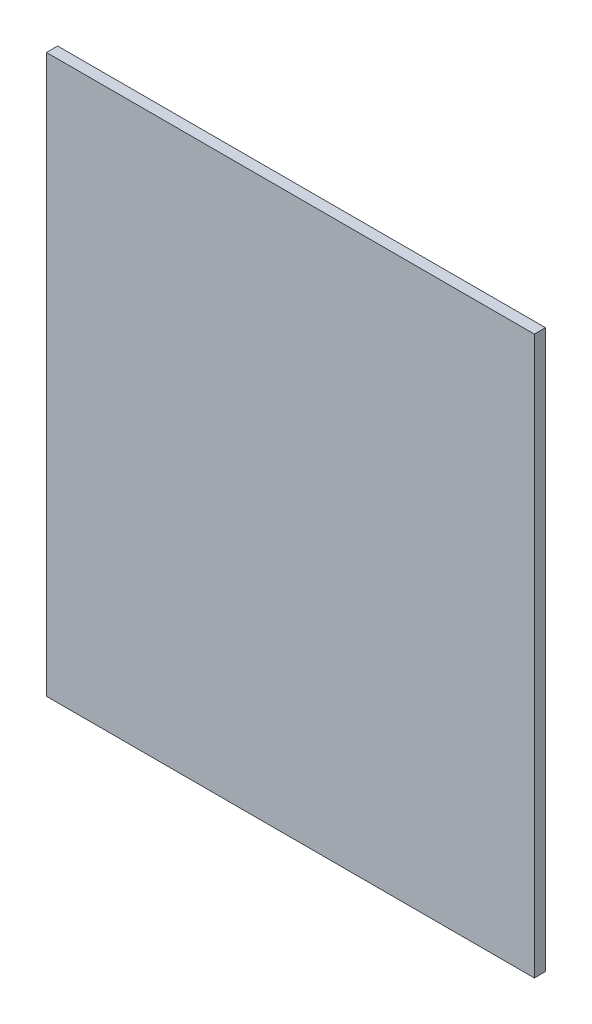
ISO-10303-21;
HEADER;
FILE_DESCRIPTION(('STEP AP214'),'2;1');
FILE_NAME('part.step','',(''),(''),'','','');
FILE_SCHEMA(('AUTOMOTIVE_DESIGN { 1 0 10303 214 1 1 1 1 }'));
ENDSEC;
DATA;
#1=APPLICATION_CONTEXT('core data for automotive mechanical design processes');
#2=APPLICATION_PROTOCOL_DEFINITION('international standard','automotive_design',2000,#1);
#3=PRODUCT_CONTEXT('',#1,'mechanical');
#4=PRODUCT('Part','Part','',(#3));
#5=PRODUCT_RELATED_PRODUCT_CATEGORY('part','',(#4));
#6=PRODUCT_DEFINITION_FORMATION('','',#4);
#7=PRODUCT_DEFINITION_CONTEXT('part definition',#1,'design');
#8=PRODUCT_DEFINITION('design','',#6,#7);
#9=PRODUCT_DEFINITION_SHAPE('','',#8);
#10=(LENGTH_UNIT() NAMED_UNIT(*) SI_UNIT(.MILLI.,.METRE.));
#11=(NAMED_UNIT(*) PLANE_ANGLE_UNIT() SI_UNIT($,.RADIAN.));
#12=(NAMED_UNIT(*) SI_UNIT($,.STERADIAN.) SOLID_ANGLE_UNIT());
#13=UNCERTAINTY_MEASURE_WITH_UNIT(LENGTH_MEASURE(1.E-05),#10,'distance_accuracy_value','');
#14=(GEOMETRIC_REPRESENTATION_CONTEXT(3) GLOBAL_UNCERTAINTY_ASSIGNED_CONTEXT((#13)) GLOBAL_UNIT_ASSIGNED_CONTEXT((#10,
#11,#12)) REPRESENTATION_CONTEXT('',''));
#15=CARTESIAN_POINT('',(0.,0.,0.));
#16=DIRECTION('',(0.,0.,1.));
#17=DIRECTION('',(1.,0.,0.));
#18=AXIS2_PLACEMENT_3D('',#15,#16,#17);
#19=CARTESIAN_POINT('',(-37.6628276091684,43.5807424593968,16.));
#20=DIRECTION('',(1.,0.,0.));
#21=DIRECTION('',(0.,1.,0.));
#22=AXIS2_PLACEMENT_3D('',#19,#20,#21);
#23=PLANE('',#22);
#24=DIRECTION('',(0.,-1.,0.));
#25=VECTOR('',#24,1.);
#26=CARTESIAN_POINT('',(-37.6628276091684,43.5807424593968,0.));
#27=LINE('',#26,#25);
#28=CARTESIAN_POINT('',(-37.6628276091684,43.5807424593968,0.));
#29=VERTEX_POINT('',#28);
#30=CARTESIAN_POINT('',(-37.6628276091683,-756.419257540603,0.));
#31=VERTEX_POINT('',#30);
#32=EDGE_CURVE('E96',#29,#31,#27,.T.);
#33=ORIENTED_EDGE('',*,*,#32,.T.);
#34=DIRECTION('',(0.,0.,-1.));
#35=VECTOR('',#34,1.);
#36=CARTESIAN_POINT('',(-37.6628276091683,-756.419257540603,16.));
#37=LINE('',#36,#35);
#38=CARTESIAN_POINT('',(-37.6628276091683,-756.419257540603,16.));
#39=VERTEX_POINT('',#38);
#40=EDGE_CURVE('E11',#39,#31,#37,.T.);
#41=ORIENTED_EDGE('',*,*,#40,.F.);
#42=DIRECTION('',(0.,-1.,0.));
#43=VECTOR('',#42,1.);
#44=CARTESIAN_POINT('',(-37.6628276091684,43.5807424593968,16.));
#45=LINE('',#44,#43);
#46=CARTESIAN_POINT('',(-37.6628276091684,43.5807424593968,16.));
#47=VERTEX_POINT('',#46);
#48=EDGE_CURVE('E84',#47,#39,#45,.T.);
#49=ORIENTED_EDGE('',*,*,#48,.F.);
#50=DIRECTION('',(0.,0.,-1.));
#51=VECTOR('',#50,1.);
#52=CARTESIAN_POINT('',(-37.6628276091684,43.5807424593968,16.));
#53=LINE('',#52,#51);
#54=EDGE_CURVE('E92',#47,#29,#53,.T.);
#55=ORIENTED_EDGE('',*,*,#54,.T.);
#56=EDGE_LOOP('',(#33,#41,#49,#55));
#57=FACE_BOUND('',#56,.T.);
#58=ADVANCED_FACE('F33',(#57),#23,.F.);
#59=CARTESIAN_POINT('',(-37.6628276091683,-756.419257540603,16.));
#60=DIRECTION('',(0.,1.,0.));
#61=DIRECTION('',(0.,0.,1.));
#62=AXIS2_PLACEMENT_3D('',#59,#60,#61);
#63=PLANE('',#62);
#64=DIRECTION('',(1.,0.,0.));
#65=VECTOR('',#64,1.);
#66=CARTESIAN_POINT('',(-37.6628276091683,-756.419257540603,0.));
#67=LINE('',#66,#65);
#68=CARTESIAN_POINT('',(662.337172390832,-756.419257540603,0.));
#69=VERTEX_POINT('',#68);
#70=EDGE_CURVE('E88',#31,#69,#67,.T.);
#71=ORIENTED_EDGE('',*,*,#70,.T.);
#72=DIRECTION('',(0.,0.,-1.));
#73=VECTOR('',#72,1.);
#74=CARTESIAN_POINT('',(662.337172390832,-756.419257540603,16.));
#75=LINE('',#74,#73);
#76=CARTESIAN_POINT('',(662.337172390832,-756.419257540603,16.));
#77=VERTEX_POINT('',#76);
#78=EDGE_CURVE('E41',#77,#69,#75,.T.);
#79=ORIENTED_EDGE('',*,*,#78,.F.);
#80=DIRECTION('',(1.,0.,0.));
#81=VECTOR('',#80,1.);
#82=CARTESIAN_POINT('',(-37.6628276091683,-756.419257540603,16.));
#83=LINE('',#82,#81);
#84=EDGE_CURVE('E79',#39,#77,#83,.T.);
#85=ORIENTED_EDGE('',*,*,#84,.F.);
#86=ORIENTED_EDGE('',*,*,#40,.T.);
#87=EDGE_LOOP('',(#71,#79,#85,#86));
#88=FACE_BOUND('',#87,.T.);
#89=ADVANCED_FACE('F87',(#88),#63,.F.);
#90=CARTESIAN_POINT('',(662.337172390832,43.5807424593968,16.));
#91=DIRECTION('',(-1.,0.,0.));
#92=DIRECTION('',(0.,-1.,0.));
#93=AXIS2_PLACEMENT_3D('',#90,#91,#92);
#94=PLANE('',#93);
#95=DIRECTION('',(0.,1.,0.));
#96=VECTOR('',#95,1.);
#97=CARTESIAN_POINT('',(662.337172390832,43.5807424593968,0.));
#98=LINE('',#97,#96);
#99=CARTESIAN_POINT('',(662.337172390832,43.5807424593968,0.));
#100=VERTEX_POINT('',#99);
#101=EDGE_CURVE('E66',#69,#100,#98,.T.);
#102=ORIENTED_EDGE('',*,*,#101,.T.);
#103=DIRECTION('',(0.,0.,-1.));
#104=VECTOR('',#103,1.);
#105=CARTESIAN_POINT('',(662.337172390832,43.5807424593968,16.));
#106=LINE('',#105,#104);
#107=CARTESIAN_POINT('',(662.337172390832,43.5807424593968,16.));
#108=VERTEX_POINT('',#107);
#109=EDGE_CURVE('E89',#108,#100,#106,.T.);
#110=ORIENTED_EDGE('',*,*,#109,.F.);
#111=DIRECTION('',(0.,1.,0.));
#112=VECTOR('',#111,1.);
#113=CARTESIAN_POINT('',(662.337172390832,43.5807424593968,16.));
#114=LINE('',#113,#112);
#115=EDGE_CURVE('E82',#77,#108,#114,.T.);
#116=ORIENTED_EDGE('',*,*,#115,.F.);
#117=ORIENTED_EDGE('',*,*,#78,.T.);
#118=EDGE_LOOP('',(#102,#110,#116,#117));
#119=FACE_BOUND('',#118,.T.);
#120=ADVANCED_FACE('F90',(#119),#94,.F.);
#121=CARTESIAN_POINT('',(-37.6628276091684,43.5807424593968,16.));
#122=DIRECTION('',(0.,-1.,0.));
#123=DIRECTION('',(0.,0.,-1.));
#124=AXIS2_PLACEMENT_3D('',#121,#122,#123);
#125=PLANE('',#124);
#126=DIRECTION('',(-1.,0.,0.));
#127=VECTOR('',#126,1.);
#128=CARTESIAN_POINT('',(-37.6628276091684,43.5807424593968,0.));
#129=LINE('',#128,#127);
#130=EDGE_CURVE('E72',#100,#29,#129,.T.);
#131=ORIENTED_EDGE('',*,*,#130,.T.);
#132=ORIENTED_EDGE('',*,*,#54,.F.);
#133=DIRECTION('',(-1.,0.,0.));
#134=VECTOR('',#133,1.);
#135=CARTESIAN_POINT('',(-37.6628276091684,43.5807424593968,16.));
#136=LINE('',#135,#134);
#137=EDGE_CURVE('E49',#108,#47,#136,.T.);
#138=ORIENTED_EDGE('',*,*,#137,.F.);
#139=ORIENTED_EDGE('',*,*,#109,.T.);
#140=EDGE_LOOP('',(#131,#132,#138,#139));
#141=FACE_BOUND('',#140,.T.);
#142=ADVANCED_FACE('F103',(#141),#125,.F.);
#143=CARTESIAN_POINT('',(0.,0.,16.));
#144=DIRECTION('',(0.,0.,1.));
#145=DIRECTION('',(1.,0.,0.));
#146=AXIS2_PLACEMENT_3D('',#143,#144,#145);
#147=PLANE('',#146);
#148=ORIENTED_EDGE('',*,*,#48,.T.);
#149=ORIENTED_EDGE('',*,*,#84,.T.);
#150=ORIENTED_EDGE('',*,*,#115,.T.);
#151=ORIENTED_EDGE('',*,*,#137,.T.);
#152=EDGE_LOOP('',(#148,#149,#150,#151));
#153=FACE_BOUND('',#152,.T.);
#154=ADVANCED_FACE('F80',(#153),#147,.T.);
#155=CARTESIAN_POINT('',(0.,0.,0.));
#156=DIRECTION('',(0.,0.,1.));
#157=DIRECTION('',(1.,0.,0.));
#158=AXIS2_PLACEMENT_3D('',#155,#156,#157);
#159=PLANE('',#158);
#160=ORIENTED_EDGE('',*,*,#32,.F.);
#161=ORIENTED_EDGE('',*,*,#130,.F.);
#162=ORIENTED_EDGE('',*,*,#101,.F.);
#163=ORIENTED_EDGE('',*,*,#70,.F.);
#164=EDGE_LOOP('',(#160,#161,#162,#163));
#165=FACE_BOUND('',#164,.T.);
#166=ADVANCED_FACE('F106',(#165),#159,.F.);
#167=CLOSED_SHELL('',(#58,#89,#120,#142,#154,#166));
#168=MANIFOLD_SOLID_BREP('B2',#167);
#169=ADVANCED_BREP_SHAPE_REPRESENTATION('',(#18,#168),#14);
#170=SHAPE_DEFINITION_REPRESENTATION(#9,#169);
ENDSEC;
END-ISO-10303-21;
